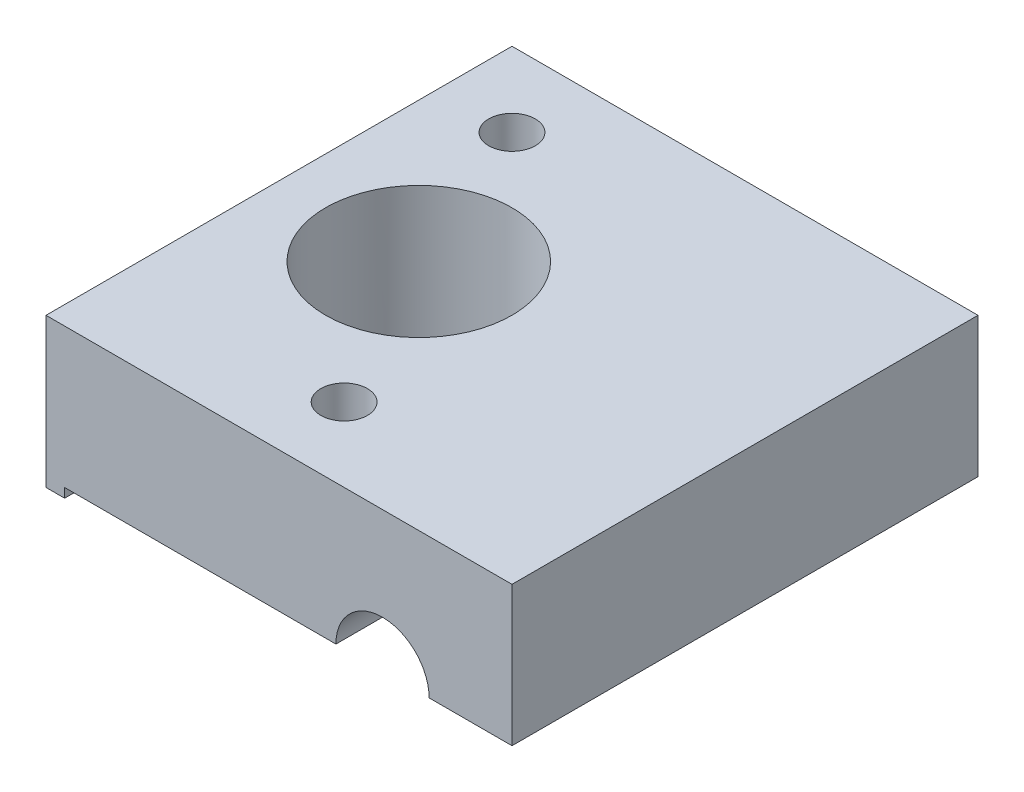
ISO-10303-21;
HEADER;
FILE_DESCRIPTION(('STEP AP214'),'2;1');
FILE_NAME('part.step','',(''),(''),'','','');
FILE_SCHEMA(('AUTOMOTIVE_DESIGN { 1 0 10303 214 1 1 1 1 }'));
ENDSEC;
DATA;
#1=APPLICATION_CONTEXT('core data for automotive mechanical design processes');
#2=APPLICATION_PROTOCOL_DEFINITION('international standard','automotive_design',2000,#1);
#3=PRODUCT_CONTEXT('',#1,'mechanical');
#4=PRODUCT('Part','Part','',(#3));
#5=PRODUCT_RELATED_PRODUCT_CATEGORY('part','',(#4));
#6=PRODUCT_DEFINITION_FORMATION('','',#4);
#7=PRODUCT_DEFINITION_CONTEXT('part definition',#1,'design');
#8=PRODUCT_DEFINITION('design','',#6,#7);
#9=PRODUCT_DEFINITION_SHAPE('','',#8);
#10=(LENGTH_UNIT() NAMED_UNIT(*) SI_UNIT(.MILLI.,.METRE.));
#11=(NAMED_UNIT(*) PLANE_ANGLE_UNIT() SI_UNIT($,.RADIAN.));
#12=(NAMED_UNIT(*) SI_UNIT($,.STERADIAN.) SOLID_ANGLE_UNIT());
#13=UNCERTAINTY_MEASURE_WITH_UNIT(LENGTH_MEASURE(1.E-05),#10,'distance_accuracy_value','');
#14=(GEOMETRIC_REPRESENTATION_CONTEXT(3) GLOBAL_UNCERTAINTY_ASSIGNED_CONTEXT((#13)) GLOBAL_UNIT_ASSIGNED_CONTEXT((#10,
#11,#12)) REPRESENTATION_CONTEXT('',''));
#15=CARTESIAN_POINT('',(0.,0.,0.));
#16=DIRECTION('',(0.,0.,1.));
#17=DIRECTION('',(1.,0.,0.));
#18=AXIS2_PLACEMENT_3D('',#15,#16,#17);
#19=CARTESIAN_POINT('',(-5.,0.,50.));
#20=DIRECTION('',(0.,1.,0.));
#21=DIRECTION('',(-1.,0.,0.));
#22=AXIS2_PLACEMENT_3D('',#19,#20,#21);
#23=PLANE('',#22);
#24=CARTESIAN_POINT('',(-21.1083377622209,0.,25.));
#25=DIRECTION('',(0.,1.,0.));
#26=DIRECTION('',(-1.,0.,0.));
#27=AXIS2_PLACEMENT_3D('',#24,#25,#26);
#28=CIRCLE('',#27,10.);
#29=CARTESIAN_POINT('',(-31.1083377622209,0.,25.));
#30=VERTEX_POINT('',#29);
#31=EDGE_CURVE('E170',#30,#30,#28,.T.);
#32=ORIENTED_EDGE('',*,*,#31,.T.);
#33=EDGE_LOOP('',(#32));
#34=FACE_BOUND('',#33,.T.);
#35=CARTESIAN_POINT('',(-28.1083377622209,0.,8.));
#36=DIRECTION('',(0.,-1.,0.));
#37=DIRECTION('',(0.,0.,-1.));
#38=AXIS2_PLACEMENT_3D('',#35,#36,#37);
#39=CIRCLE('',#38,2.5);
#40=CARTESIAN_POINT('',(-28.1083377622209,0.,5.5));
#41=VERTEX_POINT('',#40);
#42=EDGE_CURVE('E180',#41,#41,#39,.T.);
#43=ORIENTED_EDGE('',*,*,#42,.F.);
#44=EDGE_LOOP('',(#43));
#45=FACE_BOUND('',#44,.T.);
#46=CARTESIAN_POINT('',(-12.0560435447983,0.,42.0658227869789));
#47=DIRECTION('',(0.,-1.,0.));
#48=DIRECTION('',(0.,0.,-1.));
#49=AXIS2_PLACEMENT_3D('',#46,#47,#48);
#50=CIRCLE('',#49,2.5);
#51=CARTESIAN_POINT('',(-12.0560435447983,0.,39.5658227869789));
#52=VERTEX_POINT('',#51);
#53=EDGE_CURVE('E174',#52,#52,#50,.T.);
#54=ORIENTED_EDGE('',*,*,#53,.F.);
#55=EDGE_LOOP('',(#54));
#56=FACE_BOUND('',#55,.T.);
#57=DIRECTION('',(0.,0.,1.));
#58=VECTOR('',#57,1.);
#59=CARTESIAN_POINT('',(-34.1083377622209,0.,50.));
#60=LINE('',#59,#58);
#61=CARTESIAN_POINT('',(-34.1083377622209,0.,0.));
#62=VERTEX_POINT('',#61);
#63=CARTESIAN_POINT('',(-34.1083377622209,0.,50.));
#64=VERTEX_POINT('',#63);
#65=EDGE_CURVE('E169',#62,#64,#60,.T.);
#66=ORIENTED_EDGE('',*,*,#65,.F.);
#67=DIRECTION('',(1.,0.,0.));
#68=VECTOR('',#67,1.);
#69=CARTESIAN_POINT('',(-5.,0.,0.));
#70=LINE('',#69,#68);
#71=CARTESIAN_POINT('',(-5.,0.,0.));
#72=VERTEX_POINT('',#71);
#73=EDGE_CURVE('E123',#62,#72,#70,.T.);
#74=ORIENTED_EDGE('',*,*,#73,.T.);
#75=DIRECTION('',(0.,0.,-1.));
#76=VECTOR('',#75,1.);
#77=CARTESIAN_POINT('',(-5.,0.,50.));
#78=LINE('',#77,#76);
#79=CARTESIAN_POINT('',(-5.,0.,50.));
#80=VERTEX_POINT('',#79);
#81=EDGE_CURVE('E11',#80,#72,#78,.T.);
#82=ORIENTED_EDGE('',*,*,#81,.F.);
#83=DIRECTION('',(1.,0.,0.));
#84=VECTOR('',#83,1.);
#85=CARTESIAN_POINT('',(-5.,0.,50.));
#86=LINE('',#85,#84);
#87=EDGE_CURVE('E49',#64,#80,#86,.T.);
#88=ORIENTED_EDGE('',*,*,#87,.F.);
#89=EDGE_LOOP('',(#66,#74,#82,#88));
#90=FACE_BOUND('',#89,.T.);
#91=ADVANCED_FACE('F35',(#34,#45,#56,#90),#23,.F.);
#92=CARTESIAN_POINT('',(0.,0.,50.));
#93=DIRECTION('',(0.,0.,-1.));
#94=DIRECTION('',(-1.,0.,0.));
#95=AXIS2_PLACEMENT_3D('',#92,#93,#94);
#96=CYLINDRICAL_SURFACE('',#95,5.);
#97=CARTESIAN_POINT('',(0.,0.,0.));
#98=DIRECTION('',(0.,0.,-1.));
#99=DIRECTION('',(1.,0.,0.));
#100=AXIS2_PLACEMENT_3D('',#97,#98,#99);
#101=CIRCLE('',#100,5.);
#102=CARTESIAN_POINT('',(5.,0.,0.));
#103=VERTEX_POINT('',#102);
#104=EDGE_CURVE('E125',#72,#103,#101,.T.);
#105=ORIENTED_EDGE('',*,*,#104,.T.);
#106=DIRECTION('',(0.,0.,-1.));
#107=VECTOR('',#106,1.);
#108=CARTESIAN_POINT('',(5.,0.,50.));
#109=LINE('',#108,#107);
#110=CARTESIAN_POINT('',(5.,0.,50.));
#111=VERTEX_POINT('',#110);
#112=EDGE_CURVE('E42',#111,#103,#109,.T.);
#113=ORIENTED_EDGE('',*,*,#112,.F.);
#114=CARTESIAN_POINT('',(0.,0.,50.));
#115=DIRECTION('',(0.,0.,-1.));
#116=DIRECTION('',(1.,0.,0.));
#117=AXIS2_PLACEMENT_3D('',#114,#115,#116);
#118=CIRCLE('',#117,5.);
#119=EDGE_CURVE('E101',#80,#111,#118,.T.);
#120=ORIENTED_EDGE('',*,*,#119,.F.);
#121=ORIENTED_EDGE('',*,*,#81,.T.);
#122=EDGE_LOOP('',(#105,#113,#120,#121));
#123=FACE_BOUND('',#122,.T.);
#124=ADVANCED_FACE('F197',(#123),#96,.F.);
#125=CARTESIAN_POINT('',(13.8916622377791,0.,50.));
#126=DIRECTION('',(0.,1.,0.));
#127=DIRECTION('',(0.,0.,1.));
#128=AXIS2_PLACEMENT_3D('',#125,#126,#127);
#129=PLANE('',#128);
#130=DIRECTION('',(1.,0.,0.));
#131=VECTOR('',#130,1.);
#132=CARTESIAN_POINT('',(13.8916622377791,0.,0.));
#133=LINE('',#132,#131);
#134=CARTESIAN_POINT('',(13.8916622377791,0.,0.));
#135=VERTEX_POINT('',#134);
#136=EDGE_CURVE('E110',#103,#135,#133,.T.);
#137=ORIENTED_EDGE('',*,*,#136,.T.);
#138=DIRECTION('',(0.,0.,-1.));
#139=VECTOR('',#138,1.);
#140=CARTESIAN_POINT('',(13.8916622377791,0.,50.));
#141=LINE('',#140,#139);
#142=CARTESIAN_POINT('',(13.8916622377791,0.,50.));
#143=VERTEX_POINT('',#142);
#144=EDGE_CURVE('E107',#143,#135,#141,.T.);
#145=ORIENTED_EDGE('',*,*,#144,.F.);
#146=DIRECTION('',(1.,0.,0.));
#147=VECTOR('',#146,1.);
#148=CARTESIAN_POINT('',(13.8916622377791,0.,50.));
#149=LINE('',#148,#147);
#150=EDGE_CURVE('E95',#111,#143,#149,.T.);
#151=ORIENTED_EDGE('',*,*,#150,.F.);
#152=ORIENTED_EDGE('',*,*,#112,.T.);
#153=EDGE_LOOP('',(#137,#145,#151,#152));
#154=FACE_BOUND('',#153,.T.);
#155=ADVANCED_FACE('F108',(#154),#129,.F.);
#156=CARTESIAN_POINT('',(13.8916622377791,15.,50.));
#157=DIRECTION('',(-1.,0.,0.));
#158=DIRECTION('',(0.,-1.,0.));
#159=AXIS2_PLACEMENT_3D('',#156,#157,#158);
#160=PLANE('',#159);
#161=DIRECTION('',(0.,1.,0.));
#162=VECTOR('',#161,1.);
#163=CARTESIAN_POINT('',(13.8916622377791,15.,0.));
#164=LINE('',#163,#162);
#165=CARTESIAN_POINT('',(13.8916622377791,15.,0.));
#166=VERTEX_POINT('',#165);
#167=EDGE_CURVE('E129',#135,#166,#164,.T.);
#168=ORIENTED_EDGE('',*,*,#167,.T.);
#169=DIRECTION('',(0.,0.,-1.));
#170=VECTOR('',#169,1.);
#171=CARTESIAN_POINT('',(13.8916622377791,15.,50.));
#172=LINE('',#171,#170);
#173=CARTESIAN_POINT('',(13.8916622377791,15.,50.));
#174=VERTEX_POINT('',#173);
#175=EDGE_CURVE('E113',#174,#166,#172,.T.);
#176=ORIENTED_EDGE('',*,*,#175,.F.);
#177=DIRECTION('',(0.,1.,0.));
#178=VECTOR('',#177,1.);
#179=CARTESIAN_POINT('',(13.8916622377791,15.,50.));
#180=LINE('',#179,#178);
#181=EDGE_CURVE('E99',#143,#174,#180,.T.);
#182=ORIENTED_EDGE('',*,*,#181,.F.);
#183=ORIENTED_EDGE('',*,*,#144,.T.);
#184=EDGE_LOOP('',(#168,#176,#182,#183));
#185=FACE_BOUND('',#184,.T.);
#186=ADVANCED_FACE('F115',(#185),#160,.F.);
#187=CARTESIAN_POINT('',(-36.1083377622209,15.,50.));
#188=DIRECTION('',(0.,-1.,0.));
#189=DIRECTION('',(0.,0.,-1.));
#190=AXIS2_PLACEMENT_3D('',#187,#188,#189);
#191=PLANE('',#190);
#192=CARTESIAN_POINT('',(-21.1083377622209,15.,25.));
#193=DIRECTION('',(0.,1.,0.));
#194=DIRECTION('',(0.,0.,1.));
#195=AXIS2_PLACEMENT_3D('',#192,#193,#194);
#196=CIRCLE('',#195,10.);
#197=CARTESIAN_POINT('',(-21.1083377622209,15.,35.));
#198=VERTEX_POINT('',#197);
#199=EDGE_CURVE('E212',#198,#198,#196,.T.);
#200=ORIENTED_EDGE('',*,*,#199,.F.);
#201=EDGE_LOOP('',(#200));
#202=FACE_BOUND('',#201,.T.);
#203=CARTESIAN_POINT('',(-12.0560435447983,15.,42.0658227869789));
#204=DIRECTION('',(0.,-1.,0.));
#205=DIRECTION('',(0.,0.,-1.));
#206=AXIS2_PLACEMENT_3D('',#203,#204,#205);
#207=CIRCLE('',#206,2.5);
#208=CARTESIAN_POINT('',(-12.0560435447983,15.,39.5658227869789));
#209=VERTEX_POINT('',#208);
#210=EDGE_CURVE('E177',#209,#209,#207,.T.);
#211=ORIENTED_EDGE('',*,*,#210,.T.);
#212=EDGE_LOOP('',(#211));
#213=FACE_BOUND('',#212,.T.);
#214=CARTESIAN_POINT('',(-28.1083377622209,15.,8.));
#215=DIRECTION('',(0.,-1.,0.));
#216=DIRECTION('',(0.,0.,-1.));
#217=AXIS2_PLACEMENT_3D('',#214,#215,#216);
#218=CIRCLE('',#217,2.5);
#219=CARTESIAN_POINT('',(-28.1083377622209,15.,5.50000000000001));
#220=VERTEX_POINT('',#219);
#221=EDGE_CURVE('E126',#220,#220,#218,.T.);
#222=ORIENTED_EDGE('',*,*,#221,.T.);
#223=EDGE_LOOP('',(#222));
#224=FACE_BOUND('',#223,.T.);
#225=DIRECTION('',(-1.,0.,0.));
#226=VECTOR('',#225,1.);
#227=CARTESIAN_POINT('',(-36.1083377622209,15.,0.));
#228=LINE('',#227,#226);
#229=CARTESIAN_POINT('',(-36.1083377622209,15.,0.));
#230=VERTEX_POINT('',#229);
#231=EDGE_CURVE('E82',#166,#230,#228,.T.);
#232=ORIENTED_EDGE('',*,*,#231,.T.);
#233=DIRECTION('',(0.,0.,-1.));
#234=VECTOR('',#233,1.);
#235=CARTESIAN_POINT('',(-36.1083377622209,15.,50.));
#236=LINE('',#235,#234);
#237=CARTESIAN_POINT('',(-36.1083377622209,15.,50.));
#238=VERTEX_POINT('',#237);
#239=EDGE_CURVE('E122',#238,#230,#236,.T.);
#240=ORIENTED_EDGE('',*,*,#239,.F.);
#241=DIRECTION('',(-1.,0.,0.));
#242=VECTOR('',#241,1.);
#243=CARTESIAN_POINT('',(-36.1083377622209,15.,50.));
#244=LINE('',#243,#242);
#245=EDGE_CURVE('E58',#174,#238,#244,.T.);
#246=ORIENTED_EDGE('',*,*,#245,.F.);
#247=ORIENTED_EDGE('',*,*,#175,.T.);
#248=EDGE_LOOP('',(#232,#240,#246,#247));
#249=FACE_BOUND('',#248,.T.);
#250=ADVANCED_FACE('F142',(#202,#213,#224,#249),#191,.F.);
#251=CARTESIAN_POINT('',(-36.1083377622209,0.,50.));
#252=DIRECTION('',(1.,0.,0.));
#253=DIRECTION('',(0.,0.,-1.));
#254=AXIS2_PLACEMENT_3D('',#251,#252,#253);
#255=PLANE('',#254);
#256=DIRECTION('',(0.,-1.,0.));
#257=VECTOR('',#256,1.);
#258=CARTESIAN_POINT('',(-36.1083377622209,0.,0.));
#259=LINE('',#258,#257);
#260=CARTESIAN_POINT('',(-36.1083377622209,-1.00000000000001,0.));
#261=VERTEX_POINT('',#260);
#262=EDGE_CURVE('E132',#230,#261,#259,.T.);
#263=ORIENTED_EDGE('',*,*,#262,.T.);
#264=DIRECTION('',(0.,0.,-1.));
#265=VECTOR('',#264,1.);
#266=CARTESIAN_POINT('',(-36.1083377622209,-1.00000000000001,50.));
#267=LINE('',#266,#265);
#268=CARTESIAN_POINT('',(-36.1083377622209,-1.00000000000001,50.));
#269=VERTEX_POINT('',#268);
#270=EDGE_CURVE('E148',#269,#261,#267,.T.);
#271=ORIENTED_EDGE('',*,*,#270,.F.);
#272=DIRECTION('',(0.,-1.,0.));
#273=VECTOR('',#272,1.);
#274=CARTESIAN_POINT('',(-36.1083377622209,0.,50.));
#275=LINE('',#274,#273);
#276=EDGE_CURVE('E117',#238,#269,#275,.T.);
#277=ORIENTED_EDGE('',*,*,#276,.F.);
#278=ORIENTED_EDGE('',*,*,#239,.T.);
#279=EDGE_LOOP('',(#263,#271,#277,#278));
#280=FACE_BOUND('',#279,.T.);
#281=ADVANCED_FACE('F146',(#280),#255,.F.);
#282=CARTESIAN_POINT('',(0.,0.,50.));
#283=DIRECTION('',(0.,0.,1.));
#284=DIRECTION('',(1.,0.,0.));
#285=AXIS2_PLACEMENT_3D('',#282,#283,#284);
#286=PLANE('',#285);
#287=ORIENTED_EDGE('',*,*,#276,.T.);
#288=DIRECTION('',(-1.,0.,0.));
#289=VECTOR('',#288,1.);
#290=CARTESIAN_POINT('',(-36.1083377622209,-1.00000000000001,50.));
#291=LINE('',#290,#289);
#292=CARTESIAN_POINT('',(-34.1083377622209,-1.00000000000001,50.));
#293=VERTEX_POINT('',#292);
#294=EDGE_CURVE('E152',#293,#269,#291,.T.);
#295=ORIENTED_EDGE('',*,*,#294,.F.);
#296=DIRECTION('',(0.,1.,0.));
#297=VECTOR('',#296,1.);
#298=CARTESIAN_POINT('',(-34.1083377622209,-1.00000000000001,50.));
#299=LINE('',#298,#297);
#300=EDGE_CURVE('E161',#293,#64,#299,.T.);
#301=ORIENTED_EDGE('',*,*,#300,.T.);
#302=ORIENTED_EDGE('',*,*,#87,.T.);
#303=ORIENTED_EDGE('',*,*,#119,.T.);
#304=ORIENTED_EDGE('',*,*,#150,.T.);
#305=ORIENTED_EDGE('',*,*,#181,.T.);
#306=ORIENTED_EDGE('',*,*,#245,.T.);
#307=EDGE_LOOP('',(#287,#295,#301,#302,#303,#304,#305,#306));
#308=FACE_BOUND('',#307,.T.);
#309=ADVANCED_FACE('F97',(#308),#286,.T.);
#310=CARTESIAN_POINT('',(0.,0.,0.));
#311=DIRECTION('',(0.,0.,1.));
#312=DIRECTION('',(1.,0.,0.));
#313=AXIS2_PLACEMENT_3D('',#310,#311,#312);
#314=PLANE('',#313);
#315=ORIENTED_EDGE('',*,*,#73,.F.);
#316=DIRECTION('',(0.,1.,0.));
#317=VECTOR('',#316,1.);
#318=CARTESIAN_POINT('',(-34.1083377622209,-1.00000000000001,0.));
#319=LINE('',#318,#317);
#320=CARTESIAN_POINT('',(-34.1083377622209,-1.00000000000001,0.));
#321=VERTEX_POINT('',#320);
#322=EDGE_CURVE('E163',#321,#62,#319,.T.);
#323=ORIENTED_EDGE('',*,*,#322,.F.);
#324=DIRECTION('',(1.,0.,0.));
#325=VECTOR('',#324,1.);
#326=CARTESIAN_POINT('',(-36.1083377622209,-1.00000000000001,0.));
#327=LINE('',#326,#325);
#328=EDGE_CURVE('E165',#261,#321,#327,.T.);
#329=ORIENTED_EDGE('',*,*,#328,.F.);
#330=ORIENTED_EDGE('',*,*,#262,.F.);
#331=ORIENTED_EDGE('',*,*,#231,.F.);
#332=ORIENTED_EDGE('',*,*,#167,.F.);
#333=ORIENTED_EDGE('',*,*,#136,.F.);
#334=ORIENTED_EDGE('',*,*,#104,.F.);
#335=EDGE_LOOP('',(#315,#323,#329,#330,#331,#332,#333,#334));
#336=FACE_BOUND('',#335,.T.);
#337=ADVANCED_FACE('F140',(#336),#314,.F.);
#338=CARTESIAN_POINT('',(-28.1083377622209,0.,8.));
#339=DIRECTION('',(0.,-1.,0.));
#340=DIRECTION('',(0.,0.,-1.));
#341=AXIS2_PLACEMENT_3D('',#338,#339,#340);
#342=CYLINDRICAL_SURFACE('',#341,2.5);
#343=ORIENTED_EDGE('',*,*,#221,.F.);
#344=EDGE_LOOP('',(#343));
#345=FACE_BOUND('',#344,.T.);
#346=ORIENTED_EDGE('',*,*,#42,.T.);
#347=EDGE_LOOP('',(#346));
#348=FACE_BOUND('',#347,.T.);
#349=ADVANCED_FACE('F188',(#345,#348),#342,.F.);
#350=CARTESIAN_POINT('',(-12.0560435447983,0.,42.0658227869789));
#351=DIRECTION('',(0.,-1.,0.));
#352=DIRECTION('',(0.,0.,-1.));
#353=AXIS2_PLACEMENT_3D('',#350,#351,#352);
#354=CYLINDRICAL_SURFACE('',#353,2.5);
#355=ORIENTED_EDGE('',*,*,#210,.F.);
#356=EDGE_LOOP('',(#355));
#357=FACE_BOUND('',#356,.T.);
#358=ORIENTED_EDGE('',*,*,#53,.T.);
#359=EDGE_LOOP('',(#358));
#360=FACE_BOUND('',#359,.T.);
#361=ADVANCED_FACE('F191',(#357,#360),#354,.F.);
#362=CARTESIAN_POINT('',(-34.1083377622209,-1.00000000000001,50.));
#363=DIRECTION('',(-1.,0.,0.));
#364=DIRECTION('',(0.,-1.,0.));
#365=AXIS2_PLACEMENT_3D('',#362,#363,#364);
#366=PLANE('',#365);
#367=ORIENTED_EDGE('',*,*,#65,.T.);
#368=ORIENTED_EDGE('',*,*,#300,.F.);
#369=DIRECTION('',(0.,0.,1.));
#370=VECTOR('',#369,1.);
#371=CARTESIAN_POINT('',(-34.1083377622209,-1.00000000000001,50.));
#372=LINE('',#371,#370);
#373=EDGE_CURVE('E159',#321,#293,#372,.T.);
#374=ORIENTED_EDGE('',*,*,#373,.F.);
#375=ORIENTED_EDGE('',*,*,#322,.T.);
#376=EDGE_LOOP('',(#367,#368,#374,#375));
#377=FACE_BOUND('',#376,.T.);
#378=ADVANCED_FACE('F202',(#377),#366,.F.);
#379=CARTESIAN_POINT('',(0.,-1.,0.));
#380=DIRECTION('',(0.,-1.,0.));
#381=DIRECTION('',(1.,0.,0.));
#382=AXIS2_PLACEMENT_3D('',#379,#380,#381);
#383=PLANE('',#382);
#384=ORIENTED_EDGE('',*,*,#270,.T.);
#385=ORIENTED_EDGE('',*,*,#328,.T.);
#386=ORIENTED_EDGE('',*,*,#373,.T.);
#387=ORIENTED_EDGE('',*,*,#294,.T.);
#388=EDGE_LOOP('',(#384,#385,#386,#387));
#389=FACE_BOUND('',#388,.T.);
#390=ADVANCED_FACE('F155',(#389),#383,.T.);
#391=CARTESIAN_POINT('',(-21.1083377622209,-1.00000000000001,25.));
#392=DIRECTION('',(0.,1.,0.));
#393=DIRECTION('',(0.,0.,1.));
#394=AXIS2_PLACEMENT_3D('',#391,#392,#393);
#395=CYLINDRICAL_SURFACE('',#394,10.);
#396=ORIENTED_EDGE('',*,*,#199,.T.);
#397=EDGE_LOOP('',(#396));
#398=FACE_BOUND('',#397,.T.);
#399=ORIENTED_EDGE('',*,*,#31,.F.);
#400=EDGE_LOOP('',(#399));
#401=FACE_BOUND('',#400,.T.);
#402=ADVANCED_FACE('F216',(#398,#401),#395,.F.);
#403=CLOSED_SHELL('',(#91,#124,#155,#186,#250,#281,#309,#337,#349,#361,#378,#390,#402));
#404=MANIFOLD_SOLID_BREP('B2',#403);
#405=ADVANCED_BREP_SHAPE_REPRESENTATION('',(#18,#404),#14);
#406=SHAPE_DEFINITION_REPRESENTATION(#9,#405);
ENDSEC;
END-ISO-10303-21;
